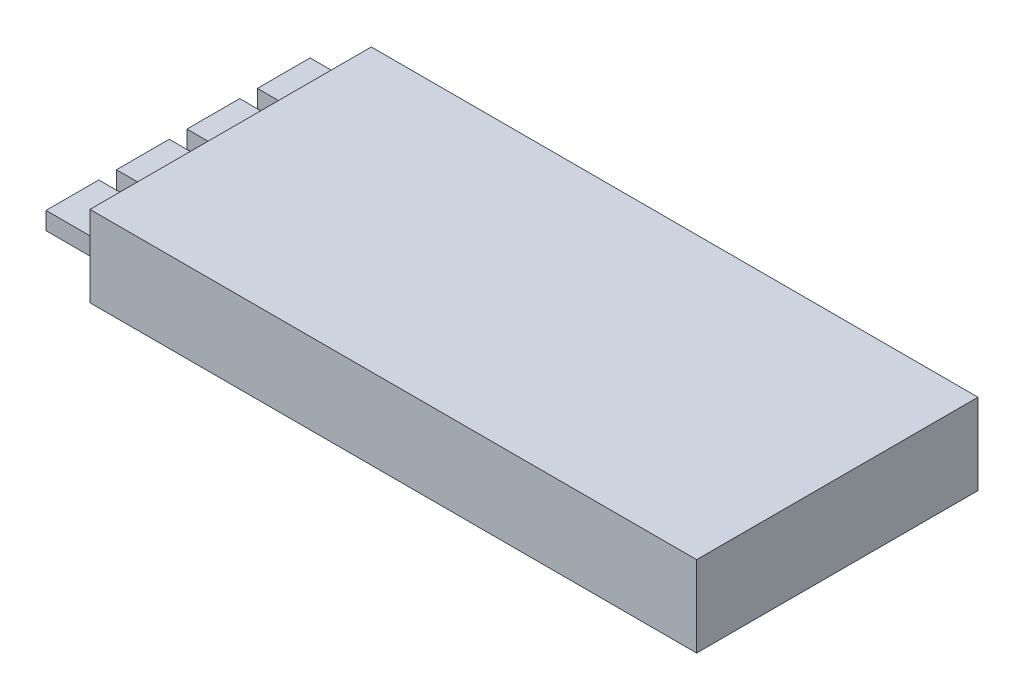
ISO-10303-21;
HEADER;
FILE_DESCRIPTION(('STEP AP214'),'2;1');
FILE_NAME('part.step','',(''),(''),'','','');
FILE_SCHEMA(('AUTOMOTIVE_DESIGN { 1 0 10303 214 1 1 1 1 }'));
ENDSEC;
DATA;
#1=APPLICATION_CONTEXT('core data for automotive mechanical design processes');
#2=APPLICATION_PROTOCOL_DEFINITION('international standard','automotive_design',2000,#1);
#3=PRODUCT_CONTEXT('',#1,'mechanical');
#4=PRODUCT('Part','Part','',(#3));
#5=PRODUCT_RELATED_PRODUCT_CATEGORY('part','',(#4));
#6=PRODUCT_DEFINITION_FORMATION('','',#4);
#7=PRODUCT_DEFINITION_CONTEXT('part definition',#1,'design');
#8=PRODUCT_DEFINITION('design','',#6,#7);
#9=PRODUCT_DEFINITION_SHAPE('','',#8);
#10=(LENGTH_UNIT() NAMED_UNIT(*) SI_UNIT(.MILLI.,.METRE.));
#11=(NAMED_UNIT(*) PLANE_ANGLE_UNIT() SI_UNIT($,.RADIAN.));
#12=(NAMED_UNIT(*) SI_UNIT($,.STERADIAN.) SOLID_ANGLE_UNIT());
#13=UNCERTAINTY_MEASURE_WITH_UNIT(LENGTH_MEASURE(1.E-05),#10,'distance_accuracy_value','');
#14=(GEOMETRIC_REPRESENTATION_CONTEXT(3) GLOBAL_UNCERTAINTY_ASSIGNED_CONTEXT((#13)) GLOBAL_UNIT_ASSIGNED_CONTEXT((#10,
#11,#12)) REPRESENTATION_CONTEXT('',''));
#15=CARTESIAN_POINT('',(0.,0.,0.));
#16=DIRECTION('',(0.,0.,1.));
#17=DIRECTION('',(1.,0.,0.));
#18=AXIS2_PLACEMENT_3D('',#15,#16,#17);
#19=CARTESIAN_POINT('',(-86.25,23.,40.));
#20=DIRECTION('',(1.,0.,0.));
#21=DIRECTION('',(0.,0.,-1.));
#22=AXIS2_PLACEMENT_3D('',#19,#20,#21);
#23=PLANE('',#22);
#24=DIRECTION('',(0.,0.,-1.));
#25=VECTOR('',#24,1.);
#26=CARTESIAN_POINT('',(-86.25,13.9999999999997,-2.56977932171467));
#27=LINE('',#26,#25);
#28=CARTESIAN_POINT('',(-86.25,13.9999999999997,-2.56977932171467));
#29=VERTEX_POINT('',#28);
#30=CARTESIAN_POINT('',(-86.25,13.9999999999997,-17.5697793217147));
#31=VERTEX_POINT('',#30);
#32=EDGE_CURVE('E190',#29,#31,#27,.T.);
#33=ORIENTED_EDGE('',*,*,#32,.F.);
#34=DIRECTION('',(0.,1.,0.));
#35=VECTOR('',#34,1.);
#36=CARTESIAN_POINT('',(-86.25,8.99999999999973,-2.56977932171467));
#37=LINE('',#36,#35);
#38=CARTESIAN_POINT('',(-86.25,8.99999999999973,-2.56977932171467));
#39=VERTEX_POINT('',#38);
#40=EDGE_CURVE('E203',#39,#29,#37,.T.);
#41=ORIENTED_EDGE('',*,*,#40,.F.);
#42=DIRECTION('',(0.,0.,1.));
#43=VECTOR('',#42,1.);
#44=CARTESIAN_POINT('',(-86.25,8.99999999999973,-2.56977932171467));
#45=LINE('',#44,#43);
#46=CARTESIAN_POINT('',(-86.25,8.99999999999973,-17.5697793217147));
#47=VERTEX_POINT('',#46);
#48=EDGE_CURVE('E212',#47,#39,#45,.T.);
#49=ORIENTED_EDGE('',*,*,#48,.F.);
#50=DIRECTION('',(0.,-1.,0.));
#51=VECTOR('',#50,1.);
#52=CARTESIAN_POINT('',(-86.25,8.99999999999973,-17.5697793217147));
#53=LINE('',#52,#51);
#54=EDGE_CURVE('E193',#31,#47,#53,.T.);
#55=ORIENTED_EDGE('',*,*,#54,.F.);
#56=EDGE_LOOP('',(#33,#41,#49,#55));
#57=FACE_BOUND('',#56,.T.);
#58=DIRECTION('',(0.,-1.,0.));
#59=VECTOR('',#58,1.);
#60=CARTESIAN_POINT('',(-86.25,9.00000000000001,22.5));
#61=LINE('',#60,#59);
#62=CARTESIAN_POINT('',(-86.25,14.,22.5));
#63=VERTEX_POINT('',#62);
#64=CARTESIAN_POINT('',(-86.25,9.00000000000001,22.5));
#65=VERTEX_POINT('',#64);
#66=EDGE_CURVE('E261',#63,#65,#61,.T.);
#67=ORIENTED_EDGE('',*,*,#66,.F.);
#68=DIRECTION('',(0.,0.,-1.));
#69=VECTOR('',#68,1.);
#70=CARTESIAN_POINT('',(-86.25,14.,37.5));
#71=LINE('',#70,#69);
#72=CARTESIAN_POINT('',(-86.25,14.,37.5));
#73=VERTEX_POINT('',#72);
#74=EDGE_CURVE('E266',#73,#63,#71,.T.);
#75=ORIENTED_EDGE('',*,*,#74,.F.);
#76=DIRECTION('',(0.,1.,0.));
#77=VECTOR('',#76,1.);
#78=CARTESIAN_POINT('',(-86.25,9.00000000000001,37.5));
#79=LINE('',#78,#77);
#80=CARTESIAN_POINT('',(-86.25,9.00000000000001,37.5));
#81=VERTEX_POINT('',#80);
#82=EDGE_CURVE('E278',#81,#73,#79,.T.);
#83=ORIENTED_EDGE('',*,*,#82,.F.);
#84=DIRECTION('',(0.,0.,1.));
#85=VECTOR('',#84,1.);
#86=CARTESIAN_POINT('',(-86.25,9.00000000000001,37.5));
#87=LINE('',#86,#85);
#88=EDGE_CURVE('E275',#65,#81,#87,.T.);
#89=ORIENTED_EDGE('',*,*,#88,.F.);
#90=EDGE_LOOP('',(#67,#75,#83,#89));
#91=FACE_BOUND('',#90,.T.);
#92=DIRECTION('',(0.,0.,1.));
#93=VECTOR('',#92,1.);
#94=CARTESIAN_POINT('',(-86.25,0.,40.));
#95=LINE('',#94,#93);
#96=CARTESIAN_POINT('',(-86.25,0.,-40.));
#97=VERTEX_POINT('',#96);
#98=CARTESIAN_POINT('',(-86.25,0.,40.));
#99=VERTEX_POINT('',#98);
#100=EDGE_CURVE('E294',#97,#99,#95,.T.);
#101=ORIENTED_EDGE('',*,*,#100,.T.);
#102=DIRECTION('',(0.,-1.,0.));
#103=VECTOR('',#102,1.);
#104=CARTESIAN_POINT('',(-86.25,23.,40.));
#105=LINE('',#104,#103);
#106=CARTESIAN_POINT('',(-86.25,23.,40.));
#107=VERTEX_POINT('',#106);
#108=EDGE_CURVE('E11',#107,#99,#105,.T.);
#109=ORIENTED_EDGE('',*,*,#108,.F.);
#110=DIRECTION('',(0.,0.,1.));
#111=VECTOR('',#110,1.);
#112=CARTESIAN_POINT('',(-86.25,23.,40.));
#113=LINE('',#112,#111);
#114=CARTESIAN_POINT('',(-86.25,23.,-40.));
#115=VERTEX_POINT('',#114);
#116=EDGE_CURVE('E295',#115,#107,#113,.T.);
#117=ORIENTED_EDGE('',*,*,#116,.F.);
#118=DIRECTION('',(0.,-1.,0.));
#119=VECTOR('',#118,1.);
#120=CARTESIAN_POINT('',(-86.25,23.,-40.));
#121=LINE('',#120,#119);
#122=EDGE_CURVE('E305',#115,#97,#121,.T.);
#123=ORIENTED_EDGE('',*,*,#122,.T.);
#124=EDGE_LOOP('',(#101,#109,#117,#123));
#125=FACE_BOUND('',#124,.T.);
#126=DIRECTION('',(0.,0.,-1.));
#127=VECTOR('',#126,1.);
#128=CARTESIAN_POINT('',(-86.25,13.9999999999999,17.4651103391427));
#129=LINE('',#128,#127);
#130=CARTESIAN_POINT('',(-86.25,13.9999999999999,17.4651103391427));
#131=VERTEX_POINT('',#130);
#132=CARTESIAN_POINT('',(-86.25,13.9999999999999,2.46511033914268));
#133=VERTEX_POINT('',#132);
#134=EDGE_CURVE('E228',#131,#133,#129,.T.);
#135=ORIENTED_EDGE('',*,*,#134,.F.);
#136=DIRECTION('',(0.,1.,0.));
#137=VECTOR('',#136,1.);
#138=CARTESIAN_POINT('',(-86.25,8.99999999999987,17.4651103391427));
#139=LINE('',#138,#137);
#140=CARTESIAN_POINT('',(-86.25,8.99999999999987,17.4651103391427));
#141=VERTEX_POINT('',#140);
#142=EDGE_CURVE('E233',#141,#131,#139,.T.);
#143=ORIENTED_EDGE('',*,*,#142,.F.);
#144=DIRECTION('',(0.,0.,1.));
#145=VECTOR('',#144,1.);
#146=CARTESIAN_POINT('',(-86.25,8.99999999999987,17.4651103391427));
#147=LINE('',#146,#145);
#148=CARTESIAN_POINT('',(-86.25,8.99999999999987,2.46511033914268));
#149=VERTEX_POINT('',#148);
#150=EDGE_CURVE('E245',#149,#141,#147,.T.);
#151=ORIENTED_EDGE('',*,*,#150,.F.);
#152=DIRECTION('',(0.,-1.,0.));
#153=VECTOR('',#152,1.);
#154=CARTESIAN_POINT('',(-86.25,8.99999999999987,2.46511033914268));
#155=LINE('',#154,#153);
#156=EDGE_CURVE('E242',#133,#149,#155,.T.);
#157=ORIENTED_EDGE('',*,*,#156,.F.);
#158=EDGE_LOOP('',(#135,#143,#151,#157));
#159=FACE_BOUND('',#158,.T.);
#160=DIRECTION('',(0.,0.,-1.));
#161=VECTOR('',#160,1.);
#162=CARTESIAN_POINT('',(-86.25,13.9999999999996,-22.604668982572));
#163=LINE('',#162,#161);
#164=CARTESIAN_POINT('',(-86.25,13.9999999999996,-22.604668982572));
#165=VERTEX_POINT('',#164);
#166=CARTESIAN_POINT('',(-86.25,13.9999999999996,-37.604668982572));
#167=VERTEX_POINT('',#166);
#168=EDGE_CURVE('E189',#165,#167,#163,.T.);
#169=ORIENTED_EDGE('',*,*,#168,.F.);
#170=DIRECTION('',(0.,1.,0.));
#171=VECTOR('',#170,1.);
#172=CARTESIAN_POINT('',(-86.25,8.99999999999959,-22.604668982572));
#173=LINE('',#172,#171);
#174=CARTESIAN_POINT('',(-86.25,8.99999999999959,-22.604668982572));
#175=VERTEX_POINT('',#174);
#176=EDGE_CURVE('E186',#175,#165,#173,.T.);
#177=ORIENTED_EDGE('',*,*,#176,.F.);
#178=DIRECTION('',(0.,0.,1.));
#179=VECTOR('',#178,1.);
#180=CARTESIAN_POINT('',(-86.25,8.99999999999959,-22.604668982572));
#181=LINE('',#180,#179);
#182=CARTESIAN_POINT('',(-86.25,8.99999999999959,-37.604668982572));
#183=VERTEX_POINT('',#182);
#184=EDGE_CURVE('E52',#183,#175,#181,.T.);
#185=ORIENTED_EDGE('',*,*,#184,.F.);
#186=DIRECTION('',(0.,-1.,0.));
#187=VECTOR('',#186,1.);
#188=CARTESIAN_POINT('',(-86.25,8.99999999999959,-37.604668982572));
#189=LINE('',#188,#187);
#190=EDGE_CURVE('E47',#167,#183,#189,.T.);
#191=ORIENTED_EDGE('',*,*,#190,.F.);
#192=EDGE_LOOP('',(#169,#177,#185,#191));
#193=FACE_BOUND('',#192,.T.);
#194=ADVANCED_FACE('F33',(#57,#91,#125,#159,#193),#23,.F.);
#195=CARTESIAN_POINT('',(86.25,23.,40.));
#196=DIRECTION('',(0.,0.,-1.));
#197=DIRECTION('',(-1.,0.,0.));
#198=AXIS2_PLACEMENT_3D('',#195,#196,#197);
#199=PLANE('',#198);
#200=DIRECTION('',(1.,0.,0.));
#201=VECTOR('',#200,1.);
#202=CARTESIAN_POINT('',(86.25,0.,40.));
#203=LINE('',#202,#201);
#204=CARTESIAN_POINT('',(86.25,0.,40.));
#205=VERTEX_POINT('',#204);
#206=EDGE_CURVE('E308',#99,#205,#203,.T.);
#207=ORIENTED_EDGE('',*,*,#206,.T.);
#208=DIRECTION('',(0.,-1.,0.));
#209=VECTOR('',#208,1.);
#210=CARTESIAN_POINT('',(86.25,23.,40.));
#211=LINE('',#210,#209);
#212=CARTESIAN_POINT('',(86.25,23.,40.));
#213=VERTEX_POINT('',#212);
#214=EDGE_CURVE('E40',#213,#205,#211,.T.);
#215=ORIENTED_EDGE('',*,*,#214,.F.);
#216=DIRECTION('',(1.,0.,0.));
#217=VECTOR('',#216,1.);
#218=CARTESIAN_POINT('',(86.25,23.,40.));
#219=LINE('',#218,#217);
#220=EDGE_CURVE('E298',#107,#213,#219,.T.);
#221=ORIENTED_EDGE('',*,*,#220,.F.);
#222=ORIENTED_EDGE('',*,*,#108,.T.);
#223=EDGE_LOOP('',(#207,#215,#221,#222));
#224=FACE_BOUND('',#223,.T.);
#225=ADVANCED_FACE('F339',(#224),#199,.F.);
#226=CARTESIAN_POINT('',(86.25,23.,40.));
#227=DIRECTION('',(-1.,0.,0.));
#228=DIRECTION('',(0.,0.,1.));
#229=AXIS2_PLACEMENT_3D('',#226,#227,#228);
#230=PLANE('',#229);
#231=DIRECTION('',(0.,0.,-1.));
#232=VECTOR('',#231,1.);
#233=CARTESIAN_POINT('',(86.25,0.,40.));
#234=LINE('',#233,#232);
#235=CARTESIAN_POINT('',(86.25,0.,-40.));
#236=VERTEX_POINT('',#235);
#237=EDGE_CURVE('E310',#205,#236,#234,.T.);
#238=ORIENTED_EDGE('',*,*,#237,.T.);
#239=DIRECTION('',(0.,-1.,0.));
#240=VECTOR('',#239,1.);
#241=CARTESIAN_POINT('',(86.25,23.,-40.));
#242=LINE('',#241,#240);
#243=CARTESIAN_POINT('',(86.25,23.,-40.));
#244=VERTEX_POINT('',#243);
#245=EDGE_CURVE('E315',#244,#236,#242,.T.);
#246=ORIENTED_EDGE('',*,*,#245,.F.);
#247=DIRECTION('',(0.,0.,-1.));
#248=VECTOR('',#247,1.);
#249=CARTESIAN_POINT('',(86.25,23.,40.));
#250=LINE('',#249,#248);
#251=EDGE_CURVE('E301',#213,#244,#250,.T.);
#252=ORIENTED_EDGE('',*,*,#251,.F.);
#253=ORIENTED_EDGE('',*,*,#214,.T.);
#254=EDGE_LOOP('',(#238,#246,#252,#253));
#255=FACE_BOUND('',#254,.T.);
#256=ADVANCED_FACE('F322',(#255),#230,.F.);
#257=CARTESIAN_POINT('',(86.25,23.,-40.));
#258=DIRECTION('',(0.,0.,1.));
#259=DIRECTION('',(1.,0.,0.));
#260=AXIS2_PLACEMENT_3D('',#257,#258,#259);
#261=PLANE('',#260);
#262=DIRECTION('',(-1.,0.,0.));
#263=VECTOR('',#262,1.);
#264=CARTESIAN_POINT('',(86.25,0.,-40.));
#265=LINE('',#264,#263);
#266=EDGE_CURVE('E299',#236,#97,#265,.T.);
#267=ORIENTED_EDGE('',*,*,#266,.T.);
#268=ORIENTED_EDGE('',*,*,#122,.F.);
#269=DIRECTION('',(-1.,0.,0.));
#270=VECTOR('',#269,1.);
#271=CARTESIAN_POINT('',(86.25,23.,-40.));
#272=LINE('',#271,#270);
#273=EDGE_CURVE('E303',#244,#115,#272,.T.);
#274=ORIENTED_EDGE('',*,*,#273,.F.);
#275=ORIENTED_EDGE('',*,*,#245,.T.);
#276=EDGE_LOOP('',(#267,#268,#274,#275));
#277=FACE_BOUND('',#276,.T.);
#278=ADVANCED_FACE('F331',(#277),#261,.F.);
#279=CARTESIAN_POINT('',(0.,23.,0.));
#280=DIRECTION('',(0.,1.,0.));
#281=DIRECTION('',(0.,0.,1.));
#282=AXIS2_PLACEMENT_3D('',#279,#280,#281);
#283=PLANE('',#282);
#284=ORIENTED_EDGE('',*,*,#116,.T.);
#285=ORIENTED_EDGE('',*,*,#220,.T.);
#286=ORIENTED_EDGE('',*,*,#251,.T.);
#287=ORIENTED_EDGE('',*,*,#273,.T.);
#288=EDGE_LOOP('',(#284,#285,#286,#287));
#289=FACE_BOUND('',#288,.T.);
#290=ADVANCED_FACE('F338',(#289),#283,.T.);
#291=CARTESIAN_POINT('',(0.,0.,0.));
#292=DIRECTION('',(0.,1.,0.));
#293=DIRECTION('',(0.,0.,1.));
#294=AXIS2_PLACEMENT_3D('',#291,#292,#293);
#295=PLANE('',#294);
#296=ORIENTED_EDGE('',*,*,#100,.F.);
#297=ORIENTED_EDGE('',*,*,#266,.F.);
#298=ORIENTED_EDGE('',*,*,#237,.F.);
#299=ORIENTED_EDGE('',*,*,#206,.F.);
#300=EDGE_LOOP('',(#296,#297,#298,#299));
#301=FACE_BOUND('',#300,.T.);
#302=ADVANCED_FACE('F328',(#301),#295,.F.);
#303=CARTESIAN_POINT('',(-101.25,9.00000000000001,22.5));
#304=DIRECTION('',(0.,0.,1.));
#305=DIRECTION('',(1.,0.,0.));
#306=AXIS2_PLACEMENT_3D('',#303,#304,#305);
#307=PLANE('',#306);
#308=ORIENTED_EDGE('',*,*,#66,.T.);
#309=DIRECTION('',(1.,0.,0.));
#310=VECTOR('',#309,1.);
#311=CARTESIAN_POINT('',(-101.25,9.00000000000001,22.5));
#312=LINE('',#311,#310);
#313=CARTESIAN_POINT('',(-101.25,9.00000000000001,22.5));
#314=VERTEX_POINT('',#313);
#315=EDGE_CURVE('E291',#314,#65,#312,.T.);
#316=ORIENTED_EDGE('',*,*,#315,.F.);
#317=DIRECTION('',(0.,-1.,0.));
#318=VECTOR('',#317,1.);
#319=CARTESIAN_POINT('',(-101.25,9.00000000000001,22.5));
#320=LINE('',#319,#318);
#321=CARTESIAN_POINT('',(-101.25,14.,22.5));
#322=VERTEX_POINT('',#321);
#323=EDGE_CURVE('E262',#322,#314,#320,.T.);
#324=ORIENTED_EDGE('',*,*,#323,.F.);
#325=DIRECTION('',(1.,0.,0.));
#326=VECTOR('',#325,1.);
#327=CARTESIAN_POINT('',(-101.25,14.,22.5));
#328=LINE('',#327,#326);
#329=EDGE_CURVE('E272',#322,#63,#328,.T.);
#330=ORIENTED_EDGE('',*,*,#329,.T.);
#331=EDGE_LOOP('',(#308,#316,#324,#330));
#332=FACE_BOUND('',#331,.T.);
#333=ADVANCED_FACE('F352',(#332),#307,.F.);
#334=CARTESIAN_POINT('',(-101.25,9.00000000000001,37.5));
#335=DIRECTION('',(0.,1.,0.));
#336=DIRECTION('',(0.,0.,1.));
#337=AXIS2_PLACEMENT_3D('',#334,#335,#336);
#338=PLANE('',#337);
#339=ORIENTED_EDGE('',*,*,#88,.T.);
#340=DIRECTION('',(1.,0.,0.));
#341=VECTOR('',#340,1.);
#342=CARTESIAN_POINT('',(-101.25,9.00000000000001,37.5));
#343=LINE('',#342,#341);
#344=CARTESIAN_POINT('',(-101.25,9.00000000000001,37.5));
#345=VERTEX_POINT('',#344);
#346=EDGE_CURVE('E288',#345,#81,#343,.T.);
#347=ORIENTED_EDGE('',*,*,#346,.F.);
#348=DIRECTION('',(0.,0.,1.));
#349=VECTOR('',#348,1.);
#350=CARTESIAN_POINT('',(-101.25,9.00000000000001,37.5));
#351=LINE('',#350,#349);
#352=EDGE_CURVE('E265',#314,#345,#351,.T.);
#353=ORIENTED_EDGE('',*,*,#352,.F.);
#354=ORIENTED_EDGE('',*,*,#315,.T.);
#355=EDGE_LOOP('',(#339,#347,#353,#354));
#356=FACE_BOUND('',#355,.T.);
#357=ADVANCED_FACE('F357',(#356),#338,.F.);
#358=CARTESIAN_POINT('',(-101.25,9.00000000000001,37.5));
#359=DIRECTION('',(0.,0.,-1.));
#360=DIRECTION('',(-1.,0.,0.));
#361=AXIS2_PLACEMENT_3D('',#358,#359,#360);
#362=PLANE('',#361);
#363=ORIENTED_EDGE('',*,*,#82,.T.);
#364=DIRECTION('',(1.,0.,0.));
#365=VECTOR('',#364,1.);
#366=CARTESIAN_POINT('',(-101.25,14.,37.5));
#367=LINE('',#366,#365);
#368=CARTESIAN_POINT('',(-101.25,14.,37.5));
#369=VERTEX_POINT('',#368);
#370=EDGE_CURVE('E285',#369,#73,#367,.T.);
#371=ORIENTED_EDGE('',*,*,#370,.F.);
#372=DIRECTION('',(0.,1.,0.));
#373=VECTOR('',#372,1.);
#374=CARTESIAN_POINT('',(-101.25,9.00000000000001,37.5));
#375=LINE('',#374,#373);
#376=EDGE_CURVE('E268',#345,#369,#375,.T.);
#377=ORIENTED_EDGE('',*,*,#376,.F.);
#378=ORIENTED_EDGE('',*,*,#346,.T.);
#379=EDGE_LOOP('',(#363,#371,#377,#378));
#380=FACE_BOUND('',#379,.T.);
#381=ADVANCED_FACE('F361',(#380),#362,.F.);
#382=CARTESIAN_POINT('',(-101.25,14.,37.5));
#383=DIRECTION('',(0.,-1.,0.));
#384=DIRECTION('',(0.,0.,-1.));
#385=AXIS2_PLACEMENT_3D('',#382,#383,#384);
#386=PLANE('',#385);
#387=ORIENTED_EDGE('',*,*,#74,.T.);
#388=ORIENTED_EDGE('',*,*,#329,.F.);
#389=DIRECTION('',(0.,0.,-1.));
#390=VECTOR('',#389,1.);
#391=CARTESIAN_POINT('',(-101.25,14.,37.5));
#392=LINE('',#391,#390);
#393=EDGE_CURVE('E270',#369,#322,#392,.T.);
#394=ORIENTED_EDGE('',*,*,#393,.F.);
#395=ORIENTED_EDGE('',*,*,#370,.T.);
#396=EDGE_LOOP('',(#387,#388,#394,#395));
#397=FACE_BOUND('',#396,.T.);
#398=ADVANCED_FACE('F365',(#397),#386,.F.);
#399=CARTESIAN_POINT('',(-101.25,0.,0.));
#400=DIRECTION('',(-1.,0.,0.));
#401=DIRECTION('',(0.,0.,1.));
#402=AXIS2_PLACEMENT_3D('',#399,#400,#401);
#403=PLANE('',#402);
#404=ORIENTED_EDGE('',*,*,#323,.T.);
#405=ORIENTED_EDGE('',*,*,#352,.T.);
#406=ORIENTED_EDGE('',*,*,#376,.T.);
#407=ORIENTED_EDGE('',*,*,#393,.T.);
#408=EDGE_LOOP('',(#404,#405,#406,#407));
#409=FACE_BOUND('',#408,.T.);
#410=ADVANCED_FACE('F369',(#409),#403,.T.);
#411=CARTESIAN_POINT('',(-101.25,13.9999999999999,17.4651103391427));
#412=DIRECTION('',(0.,-1.,0.));
#413=DIRECTION('',(0.,0.,-1.));
#414=AXIS2_PLACEMENT_3D('',#411,#412,#413);
#415=PLANE('',#414);
#416=ORIENTED_EDGE('',*,*,#134,.T.);
#417=DIRECTION('',(1.,0.,0.));
#418=VECTOR('',#417,1.);
#419=CARTESIAN_POINT('',(-101.25,13.9999999999999,2.46511033914268));
#420=LINE('',#419,#418);
#421=CARTESIAN_POINT('',(-101.25,13.9999999999999,2.46511033914268));
#422=VERTEX_POINT('',#421);
#423=EDGE_CURVE('E258',#422,#133,#420,.T.);
#424=ORIENTED_EDGE('',*,*,#423,.F.);
#425=DIRECTION('',(0.,0.,-1.));
#426=VECTOR('',#425,1.);
#427=CARTESIAN_POINT('',(-101.25,13.9999999999999,17.4651103391427));
#428=LINE('',#427,#426);
#429=CARTESIAN_POINT('',(-101.25,13.9999999999999,17.4651103391427));
#430=VERTEX_POINT('',#429);
#431=EDGE_CURVE('E229',#430,#422,#428,.T.);
#432=ORIENTED_EDGE('',*,*,#431,.F.);
#433=DIRECTION('',(1.,0.,0.));
#434=VECTOR('',#433,1.);
#435=CARTESIAN_POINT('',(-101.25,13.9999999999999,17.4651103391427));
#436=LINE('',#435,#434);
#437=EDGE_CURVE('E239',#430,#131,#436,.T.);
#438=ORIENTED_EDGE('',*,*,#437,.T.);
#439=EDGE_LOOP('',(#416,#424,#432,#438));
#440=FACE_BOUND('',#439,.T.);
#441=ADVANCED_FACE('F373',(#440),#415,.F.);
#442=CARTESIAN_POINT('',(-101.25,8.99999999999987,2.46511033914268));
#443=DIRECTION('',(0.,0.,1.));
#444=DIRECTION('',(1.,0.,0.));
#445=AXIS2_PLACEMENT_3D('',#442,#443,#444);
#446=PLANE('',#445);
#447=ORIENTED_EDGE('',*,*,#156,.T.);
#448=DIRECTION('',(1.,0.,0.));
#449=VECTOR('',#448,1.);
#450=CARTESIAN_POINT('',(-101.25,8.99999999999987,2.46511033914268));
#451=LINE('',#450,#449);
#452=CARTESIAN_POINT('',(-101.25,8.99999999999987,2.46511033914268));
#453=VERTEX_POINT('',#452);
#454=EDGE_CURVE('E255',#453,#149,#451,.T.);
#455=ORIENTED_EDGE('',*,*,#454,.F.);
#456=DIRECTION('',(0.,-1.,0.));
#457=VECTOR('',#456,1.);
#458=CARTESIAN_POINT('',(-101.25,8.99999999999987,2.46511033914268));
#459=LINE('',#458,#457);
#460=EDGE_CURVE('E232',#422,#453,#459,.T.);
#461=ORIENTED_EDGE('',*,*,#460,.F.);
#462=ORIENTED_EDGE('',*,*,#423,.T.);
#463=EDGE_LOOP('',(#447,#455,#461,#462));
#464=FACE_BOUND('',#463,.T.);
#465=ADVANCED_FACE('F377',(#464),#446,.F.);
#466=CARTESIAN_POINT('',(-101.25,8.99999999999987,17.4651103391427));
#467=DIRECTION('',(0.,1.,0.));
#468=DIRECTION('',(0.,0.,1.));
#469=AXIS2_PLACEMENT_3D('',#466,#467,#468);
#470=PLANE('',#469);
#471=ORIENTED_EDGE('',*,*,#150,.T.);
#472=DIRECTION('',(1.,0.,0.));
#473=VECTOR('',#472,1.);
#474=CARTESIAN_POINT('',(-101.25,8.99999999999987,17.4651103391427));
#475=LINE('',#474,#473);
#476=CARTESIAN_POINT('',(-101.25,8.99999999999987,17.4651103391427));
#477=VERTEX_POINT('',#476);
#478=EDGE_CURVE('E252',#477,#141,#475,.T.);
#479=ORIENTED_EDGE('',*,*,#478,.F.);
#480=DIRECTION('',(0.,0.,1.));
#481=VECTOR('',#480,1.);
#482=CARTESIAN_POINT('',(-101.25,8.99999999999987,17.4651103391427));
#483=LINE('',#482,#481);
#484=EDGE_CURVE('E235',#453,#477,#483,.T.);
#485=ORIENTED_EDGE('',*,*,#484,.F.);
#486=ORIENTED_EDGE('',*,*,#454,.T.);
#487=EDGE_LOOP('',(#471,#479,#485,#486));
#488=FACE_BOUND('',#487,.T.);
#489=ADVANCED_FACE('F381',(#488),#470,.F.);
#490=CARTESIAN_POINT('',(-101.25,8.99999999999987,17.4651103391427));
#491=DIRECTION('',(0.,0.,-1.));
#492=DIRECTION('',(-1.,0.,0.));
#493=AXIS2_PLACEMENT_3D('',#490,#491,#492);
#494=PLANE('',#493);
#495=ORIENTED_EDGE('',*,*,#142,.T.);
#496=ORIENTED_EDGE('',*,*,#437,.F.);
#497=DIRECTION('',(0.,1.,0.));
#498=VECTOR('',#497,1.);
#499=CARTESIAN_POINT('',(-101.25,8.99999999999987,17.4651103391427));
#500=LINE('',#499,#498);
#501=EDGE_CURVE('E237',#477,#430,#500,.T.);
#502=ORIENTED_EDGE('',*,*,#501,.F.);
#503=ORIENTED_EDGE('',*,*,#478,.T.);
#504=EDGE_LOOP('',(#495,#496,#502,#503));
#505=FACE_BOUND('',#504,.T.);
#506=ADVANCED_FACE('F385',(#505),#494,.F.);
#507=CARTESIAN_POINT('',(-101.25,0.,0.));
#508=DIRECTION('',(1.,0.,0.));
#509=DIRECTION('',(0.,0.,-1.));
#510=AXIS2_PLACEMENT_3D('',#507,#508,#509);
#511=PLANE('',#510);
#512=ORIENTED_EDGE('',*,*,#431,.T.);
#513=ORIENTED_EDGE('',*,*,#460,.T.);
#514=ORIENTED_EDGE('',*,*,#484,.T.);
#515=ORIENTED_EDGE('',*,*,#501,.T.);
#516=EDGE_LOOP('',(#512,#513,#514,#515));
#517=FACE_BOUND('',#516,.T.);
#518=ADVANCED_FACE('F389',(#517),#511,.F.);
#519=CARTESIAN_POINT('',(-101.25,13.9999999999997,-2.56977932171467));
#520=DIRECTION('',(0.,-1.,0.));
#521=DIRECTION('',(0.,0.,-1.));
#522=AXIS2_PLACEMENT_3D('',#519,#520,#521);
#523=PLANE('',#522);
#524=ORIENTED_EDGE('',*,*,#32,.T.);
#525=DIRECTION('',(1.,0.,0.));
#526=VECTOR('',#525,1.);
#527=CARTESIAN_POINT('',(-101.25,13.9999999999997,-17.5697793217147));
#528=LINE('',#527,#526);
#529=CARTESIAN_POINT('',(-101.25,13.9999999999997,-17.5697793217147));
#530=VERTEX_POINT('',#529);
#531=EDGE_CURVE('E225',#530,#31,#528,.T.);
#532=ORIENTED_EDGE('',*,*,#531,.F.);
#533=DIRECTION('',(0.,0.,-1.));
#534=VECTOR('',#533,1.);
#535=CARTESIAN_POINT('',(-101.25,13.9999999999997,-2.56977932171467));
#536=LINE('',#535,#534);
#537=CARTESIAN_POINT('',(-101.25,13.9999999999997,-2.56977932171467));
#538=VERTEX_POINT('',#537);
#539=EDGE_CURVE('E199',#538,#530,#536,.T.);
#540=ORIENTED_EDGE('',*,*,#539,.F.);
#541=DIRECTION('',(1.,0.,0.));
#542=VECTOR('',#541,1.);
#543=CARTESIAN_POINT('',(-101.25,13.9999999999997,-2.56977932171467));
#544=LINE('',#543,#542);
#545=EDGE_CURVE('E208',#538,#29,#544,.T.);
#546=ORIENTED_EDGE('',*,*,#545,.T.);
#547=EDGE_LOOP('',(#524,#532,#540,#546));
#548=FACE_BOUND('',#547,.T.);
#549=ADVANCED_FACE('F393',(#548),#523,.F.);
#550=CARTESIAN_POINT('',(-101.25,8.99999999999973,-17.5697793217147));
#551=DIRECTION('',(0.,0.,1.));
#552=DIRECTION('',(1.,0.,0.));
#553=AXIS2_PLACEMENT_3D('',#550,#551,#552);
#554=PLANE('',#553);
#555=ORIENTED_EDGE('',*,*,#54,.T.);
#556=DIRECTION('',(1.,0.,0.));
#557=VECTOR('',#556,1.);
#558=CARTESIAN_POINT('',(-101.25,8.99999999999973,-17.5697793217147));
#559=LINE('',#558,#557);
#560=CARTESIAN_POINT('',(-101.25,8.99999999999973,-17.5697793217147));
#561=VERTEX_POINT('',#560);
#562=EDGE_CURVE('E222',#561,#47,#559,.T.);
#563=ORIENTED_EDGE('',*,*,#562,.F.);
#564=DIRECTION('',(0.,-1.,0.));
#565=VECTOR('',#564,1.);
#566=CARTESIAN_POINT('',(-101.25,8.99999999999973,-17.5697793217147));
#567=LINE('',#566,#565);
#568=EDGE_CURVE('E202',#530,#561,#567,.T.);
#569=ORIENTED_EDGE('',*,*,#568,.F.);
#570=ORIENTED_EDGE('',*,*,#531,.T.);
#571=EDGE_LOOP('',(#555,#563,#569,#570));
#572=FACE_BOUND('',#571,.T.);
#573=ADVANCED_FACE('F397',(#572),#554,.F.);
#574=CARTESIAN_POINT('',(-101.25,8.99999999999973,-2.56977932171467));
#575=DIRECTION('',(0.,1.,0.));
#576=DIRECTION('',(0.,0.,1.));
#577=AXIS2_PLACEMENT_3D('',#574,#575,#576);
#578=PLANE('',#577);
#579=ORIENTED_EDGE('',*,*,#48,.T.);
#580=DIRECTION('',(1.,0.,0.));
#581=VECTOR('',#580,1.);
#582=CARTESIAN_POINT('',(-101.25,8.99999999999973,-2.56977932171467));
#583=LINE('',#582,#581);
#584=CARTESIAN_POINT('',(-101.25,8.99999999999973,-2.56977932171467));
#585=VERTEX_POINT('',#584);
#586=EDGE_CURVE('E219',#585,#39,#583,.T.);
#587=ORIENTED_EDGE('',*,*,#586,.F.);
#588=DIRECTION('',(0.,0.,1.));
#589=VECTOR('',#588,1.);
#590=CARTESIAN_POINT('',(-101.25,8.99999999999973,-2.56977932171467));
#591=LINE('',#590,#589);
#592=EDGE_CURVE('E205',#561,#585,#591,.T.);
#593=ORIENTED_EDGE('',*,*,#592,.F.);
#594=ORIENTED_EDGE('',*,*,#562,.T.);
#595=EDGE_LOOP('',(#579,#587,#593,#594));
#596=FACE_BOUND('',#595,.T.);
#597=ADVANCED_FACE('F401',(#596),#578,.F.);
#598=CARTESIAN_POINT('',(-101.25,8.99999999999973,-2.56977932171467));
#599=DIRECTION('',(0.,0.,-1.));
#600=DIRECTION('',(-1.,0.,0.));
#601=AXIS2_PLACEMENT_3D('',#598,#599,#600);
#602=PLANE('',#601);
#603=ORIENTED_EDGE('',*,*,#40,.T.);
#604=ORIENTED_EDGE('',*,*,#545,.F.);
#605=DIRECTION('',(0.,1.,0.));
#606=VECTOR('',#605,1.);
#607=CARTESIAN_POINT('',(-101.25,8.99999999999973,-2.56977932171467));
#608=LINE('',#607,#606);
#609=EDGE_CURVE('E207',#585,#538,#608,.T.);
#610=ORIENTED_EDGE('',*,*,#609,.F.);
#611=ORIENTED_EDGE('',*,*,#586,.T.);
#612=EDGE_LOOP('',(#603,#604,#610,#611));
#613=FACE_BOUND('',#612,.T.);
#614=ADVANCED_FACE('F405',(#613),#602,.F.);
#615=CARTESIAN_POINT('',(-101.25,0.,0.));
#616=DIRECTION('',(1.,0.,0.));
#617=DIRECTION('',(0.,0.,-1.));
#618=AXIS2_PLACEMENT_3D('',#615,#616,#617);
#619=PLANE('',#618);
#620=ORIENTED_EDGE('',*,*,#539,.T.);
#621=ORIENTED_EDGE('',*,*,#568,.T.);
#622=ORIENTED_EDGE('',*,*,#592,.T.);
#623=ORIENTED_EDGE('',*,*,#609,.T.);
#624=EDGE_LOOP('',(#620,#621,#622,#623));
#625=FACE_BOUND('',#624,.T.);
#626=ADVANCED_FACE('F409',(#625),#619,.F.);
#627=CARTESIAN_POINT('',(-101.25,13.9999999999996,-22.604668982572));
#628=DIRECTION('',(0.,-1.,0.));
#629=DIRECTION('',(0.,0.,-1.));
#630=AXIS2_PLACEMENT_3D('',#627,#628,#629);
#631=PLANE('',#630);
#632=ORIENTED_EDGE('',*,*,#168,.T.);
#633=DIRECTION('',(1.,0.,0.));
#634=VECTOR('',#633,1.);
#635=CARTESIAN_POINT('',(-101.25,13.9999999999996,-37.604668982572));
#636=LINE('',#635,#634);
#637=CARTESIAN_POINT('',(-101.25,13.9999999999996,-37.604668982572));
#638=VERTEX_POINT('',#637);
#639=EDGE_CURVE('E170',#638,#167,#636,.T.);
#640=ORIENTED_EDGE('',*,*,#639,.F.);
#641=DIRECTION('',(0.,0.,-1.));
#642=VECTOR('',#641,1.);
#643=CARTESIAN_POINT('',(-101.25,13.9999999999996,-22.604668982572));
#644=LINE('',#643,#642);
#645=CARTESIAN_POINT('',(-101.25,13.9999999999996,-22.604668982572));
#646=VERTEX_POINT('',#645);
#647=EDGE_CURVE('E177',#646,#638,#644,.T.);
#648=ORIENTED_EDGE('',*,*,#647,.F.);
#649=DIRECTION('',(1.,0.,0.));
#650=VECTOR('',#649,1.);
#651=CARTESIAN_POINT('',(-101.25,13.9999999999996,-22.604668982572));
#652=LINE('',#651,#650);
#653=EDGE_CURVE('E583',#646,#165,#652,.T.);
#654=ORIENTED_EDGE('',*,*,#653,.T.);
#655=EDGE_LOOP('',(#632,#640,#648,#654));
#656=FACE_BOUND('',#655,.T.);
#657=ADVANCED_FACE('F188',(#656),#631,.F.);
#658=CARTESIAN_POINT('',(-101.25,8.99999999999959,-37.604668982572));
#659=DIRECTION('',(0.,0.,1.));
#660=DIRECTION('',(1.,0.,0.));
#661=AXIS2_PLACEMENT_3D('',#658,#659,#660);
#662=PLANE('',#661);
#663=ORIENTED_EDGE('',*,*,#190,.T.);
#664=DIRECTION('',(1.,0.,0.));
#665=VECTOR('',#664,1.);
#666=CARTESIAN_POINT('',(-101.25,8.99999999999959,-37.604668982572));
#667=LINE('',#666,#665);
#668=CARTESIAN_POINT('',(-101.25,8.99999999999959,-37.604668982572));
#669=VERTEX_POINT('',#668);
#670=EDGE_CURVE('E173',#669,#183,#667,.T.);
#671=ORIENTED_EDGE('',*,*,#670,.F.);
#672=DIRECTION('',(0.,-1.,0.));
#673=VECTOR('',#672,1.);
#674=CARTESIAN_POINT('',(-101.25,8.99999999999959,-37.604668982572));
#675=LINE('',#674,#673);
#676=EDGE_CURVE('E166',#638,#669,#675,.T.);
#677=ORIENTED_EDGE('',*,*,#676,.F.);
#678=ORIENTED_EDGE('',*,*,#639,.T.);
#679=EDGE_LOOP('',(#663,#671,#677,#678));
#680=FACE_BOUND('',#679,.T.);
#681=ADVANCED_FACE('F168',(#680),#662,.F.);
#682=CARTESIAN_POINT('',(-101.25,8.99999999999959,-22.604668982572));
#683=DIRECTION('',(0.,1.,0.));
#684=DIRECTION('',(0.,0.,1.));
#685=AXIS2_PLACEMENT_3D('',#682,#683,#684);
#686=PLANE('',#685);
#687=ORIENTED_EDGE('',*,*,#184,.T.);
#688=DIRECTION('',(1.,0.,0.));
#689=VECTOR('',#688,1.);
#690=CARTESIAN_POINT('',(-101.25,8.99999999999959,-22.604668982572));
#691=LINE('',#690,#689);
#692=CARTESIAN_POINT('',(-101.25,8.99999999999959,-22.604668982572));
#693=VERTEX_POINT('',#692);
#694=EDGE_CURVE('E195',#693,#175,#691,.T.);
#695=ORIENTED_EDGE('',*,*,#694,.F.);
#696=DIRECTION('',(0.,0.,1.));
#697=VECTOR('',#696,1.);
#698=CARTESIAN_POINT('',(-101.25,8.99999999999959,-22.604668982572));
#699=LINE('',#698,#697);
#700=EDGE_CURVE('E176',#669,#693,#699,.T.);
#701=ORIENTED_EDGE('',*,*,#700,.F.);
#702=ORIENTED_EDGE('',*,*,#670,.T.);
#703=EDGE_LOOP('',(#687,#695,#701,#702));
#704=FACE_BOUND('',#703,.T.);
#705=ADVANCED_FACE('F418',(#704),#686,.F.);
#706=CARTESIAN_POINT('',(-101.25,8.99999999999959,-22.604668982572));
#707=DIRECTION('',(0.,0.,-1.));
#708=DIRECTION('',(-1.,0.,0.));
#709=AXIS2_PLACEMENT_3D('',#706,#707,#708);
#710=PLANE('',#709);
#711=ORIENTED_EDGE('',*,*,#176,.T.);
#712=ORIENTED_EDGE('',*,*,#653,.F.);
#713=DIRECTION('',(0.,1.,0.));
#714=VECTOR('',#713,1.);
#715=CARTESIAN_POINT('',(-101.25,8.99999999999959,-22.604668982572));
#716=LINE('',#715,#714);
#717=EDGE_CURVE('E182',#693,#646,#716,.T.);
#718=ORIENTED_EDGE('',*,*,#717,.F.);
#719=ORIENTED_EDGE('',*,*,#694,.T.);
#720=EDGE_LOOP('',(#711,#712,#718,#719));
#721=FACE_BOUND('',#720,.T.);
#722=ADVANCED_FACE('F421',(#721),#710,.F.);
#723=CARTESIAN_POINT('',(-101.25,0.,0.));
#724=DIRECTION('',(1.,0.,0.));
#725=DIRECTION('',(0.,0.,-1.));
#726=AXIS2_PLACEMENT_3D('',#723,#724,#725);
#727=PLANE('',#726);
#728=ORIENTED_EDGE('',*,*,#647,.T.);
#729=ORIENTED_EDGE('',*,*,#676,.T.);
#730=ORIENTED_EDGE('',*,*,#700,.T.);
#731=ORIENTED_EDGE('',*,*,#717,.T.);
#732=EDGE_LOOP('',(#728,#729,#730,#731));
#733=FACE_BOUND('',#732,.T.);
#734=ADVANCED_FACE('F180',(#733),#727,.F.);
#735=CLOSED_SHELL('',(#194,#225,#256,#278,#290,#302,#333,#357,#381,#398,#410,#441,#465,#489,
#506,#518,#549,#573,#597,#614,#626,#657,#681,#705,#722,#734));
#736=MANIFOLD_SOLID_BREP('B2',#735);
#737=ADVANCED_BREP_SHAPE_REPRESENTATION('',(#18,#736),#14);
#738=SHAPE_DEFINITION_REPRESENTATION(#9,#737);
ENDSEC;
END-ISO-10303-21;
